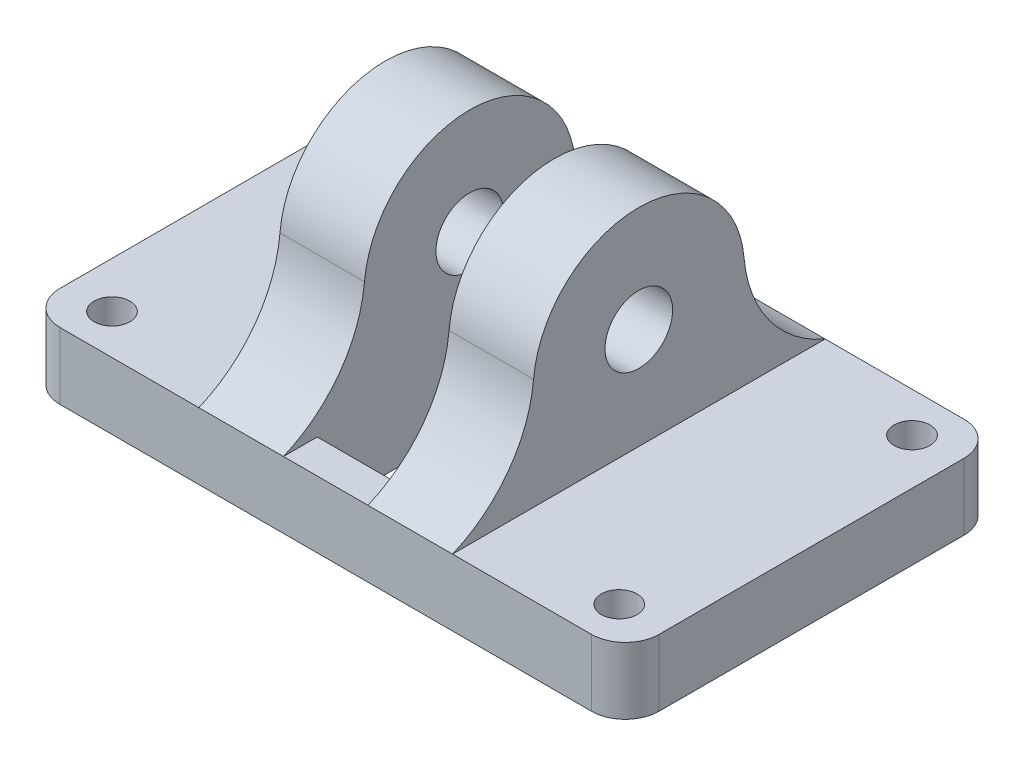
ISO-10303-21;
HEADER;
FILE_DESCRIPTION(('STEP AP214'),'2;1');
FILE_NAME('part.step','',(''),(''),'','','');
FILE_SCHEMA(('AUTOMOTIVE_DESIGN { 1 0 10303 214 1 1 1 1 }'));
ENDSEC;
DATA;
#1=APPLICATION_CONTEXT('core data for automotive mechanical design processes');
#2=APPLICATION_PROTOCOL_DEFINITION('international standard','automotive_design',2000,#1);
#3=PRODUCT_CONTEXT('',#1,'mechanical');
#4=PRODUCT('Part','Part','',(#3));
#5=PRODUCT_RELATED_PRODUCT_CATEGORY('part','',(#4));
#6=PRODUCT_DEFINITION_FORMATION('','',#4);
#7=PRODUCT_DEFINITION_CONTEXT('part definition',#1,'design');
#8=PRODUCT_DEFINITION('design','',#6,#7);
#9=PRODUCT_DEFINITION_SHAPE('','',#8);
#10=(LENGTH_UNIT() NAMED_UNIT(*) SI_UNIT(.MILLI.,.METRE.));
#11=(NAMED_UNIT(*) PLANE_ANGLE_UNIT() SI_UNIT($,.RADIAN.));
#12=(NAMED_UNIT(*) SI_UNIT($,.STERADIAN.) SOLID_ANGLE_UNIT());
#13=UNCERTAINTY_MEASURE_WITH_UNIT(LENGTH_MEASURE(1.E-05),#10,'distance_accuracy_value','');
#14=(GEOMETRIC_REPRESENTATION_CONTEXT(3) GLOBAL_UNCERTAINTY_ASSIGNED_CONTEXT((#13)) GLOBAL_UNIT_ASSIGNED_CONTEXT((#10,
#11,#12)) REPRESENTATION_CONTEXT('',''));
#15=CARTESIAN_POINT('',(0.,0.,0.));
#16=DIRECTION('',(0.,0.,1.));
#17=DIRECTION('',(1.,0.,0.));
#18=AXIS2_PLACEMENT_3D('',#15,#16,#17);
#19=CARTESIAN_POINT('',(0.,5.0038,0.));
#20=DIRECTION('',(0.,-1.,0.));
#21=DIRECTION('',(0.,0.,-1.));
#22=AXIS2_PLACEMENT_3D('',#19,#20,#21);
#23=PLANE('',#22);
#24=DIRECTION('',(0.,0.,1.));
#25=VECTOR('',#24,1.);
#26=CARTESIAN_POINT('',(25.6794,5.0038,0.));
#27=LINE('',#26,#25);
#28=CARTESIAN_POINT('',(25.6794,5.0038,-2.54));
#29=VERTEX_POINT('',#28);
#30=CARTESIAN_POINT('',(25.6794,5.0038,0.));
#31=VERTEX_POINT('',#30);
#32=EDGE_CURVE('E318',#29,#31,#27,.T.);
#33=ORIENTED_EDGE('',*,*,#32,.F.);
#34=DIRECTION('',(1.,0.,0.));
#35=VECTOR('',#34,1.);
#36=CARTESIAN_POINT('',(25.6794,5.0038,-2.54));
#37=LINE('',#36,#35);
#38=CARTESIAN_POINT('',(19.3294,5.0038,-2.54));
#39=VERTEX_POINT('',#38);
#40=EDGE_CURVE('E191',#39,#29,#37,.T.);
#41=ORIENTED_EDGE('',*,*,#40,.F.);
#42=DIRECTION('',(0.,0.,1.));
#43=VECTOR('',#42,1.);
#44=CARTESIAN_POINT('',(19.3294,5.0038,0.));
#45=LINE('',#44,#43);
#46=CARTESIAN_POINT('',(19.3294,5.0038,0.));
#47=VERTEX_POINT('',#46);
#48=EDGE_CURVE('E322',#39,#47,#45,.T.);
#49=ORIENTED_EDGE('',*,*,#48,.T.);
#50=DIRECTION('',(1.,0.,0.));
#51=VECTOR('',#50,1.);
#52=CARTESIAN_POINT('',(0.,5.0038,0.));
#53=LINE('',#52,#51);
#54=EDGE_CURVE('E371',#47,#31,#53,.T.);
#55=ORIENTED_EDGE('',*,*,#54,.T.);
#56=EDGE_LOOP('',(#33,#41,#49,#55));
#57=FACE_BOUND('',#56,.T.);
#58=ADVANCED_FACE('F34',(#57),#23,.F.);
#59=CARTESIAN_POINT('',(41.5544,5.0038,-2.9972));
#60=DIRECTION('',(0.,1.,0.));
#61=DIRECTION('',(0.,0.,-1.));
#62=AXIS2_PLACEMENT_3D('',#59,#60,#61);
#63=CIRCLE('',#62,1.3462);
#64=CARTESIAN_POINT('',(41.5544,5.0038,-4.3434));
#65=VERTEX_POINT('',#64);
#66=EDGE_CURVE('E238',#65,#65,#63,.T.);
#67=ORIENTED_EDGE('',*,*,#66,.F.);
#68=EDGE_LOOP('',(#67));
#69=FACE_BOUND('',#68,.T.);
#70=CARTESIAN_POINT('',(41.5544,5.0038,-24.9936));
#71=DIRECTION('',(0.,1.,0.));
#72=DIRECTION('',(0.,0.,1.));
#73=AXIS2_PLACEMENT_3D('',#70,#71,#72);
#74=CIRCLE('',#73,1.3462);
#75=CARTESIAN_POINT('',(41.5544,5.0038,-23.6474));
#76=VERTEX_POINT('',#75);
#77=EDGE_CURVE('E244',#76,#76,#74,.T.);
#78=ORIENTED_EDGE('',*,*,#77,.F.);
#79=EDGE_LOOP('',(#78));
#80=FACE_BOUND('',#79,.T.);
#81=DIRECTION('',(0.,0.,1.));
#82=VECTOR('',#81,1.);
#83=CARTESIAN_POINT('',(32.0294,5.0038,0.));
#84=LINE('',#83,#82);
#85=CARTESIAN_POINT('',(32.0294,5.0038,-27.9908));
#86=VERTEX_POINT('',#85);
#87=CARTESIAN_POINT('',(32.0294,5.0038,0.));
#88=VERTEX_POINT('',#87);
#89=EDGE_CURVE('E320',#86,#88,#84,.T.);
#90=ORIENTED_EDGE('',*,*,#89,.T.);
#91=CARTESIAN_POINT('',(42.4688,5.0038,0.));
#92=VERTEX_POINT('',#91);
#93=EDGE_CURVE('E256',#88,#92,#53,.T.);
#94=ORIENTED_EDGE('',*,*,#93,.T.);
#95=CARTESIAN_POINT('',(42.4688,5.0038,-2.54));
#96=DIRECTION('',(0.,-1.,0.));
#97=DIRECTION('',(0.,0.,-1.));
#98=AXIS2_PLACEMENT_3D('',#95,#96,#97);
#99=CIRCLE('',#98,2.54);
#100=CARTESIAN_POINT('',(45.0088,5.0038,-2.54));
#101=VERTEX_POINT('',#100);
#102=EDGE_CURVE('E299',#92,#101,#99,.F.);
#103=ORIENTED_EDGE('',*,*,#102,.T.);
#104=DIRECTION('',(0.,0.,-1.));
#105=VECTOR('',#104,1.);
#106=CARTESIAN_POINT('',(45.0088,5.0038,0.));
#107=LINE('',#106,#105);
#108=CARTESIAN_POINT('',(45.0088,5.0038,-25.4508));
#109=VERTEX_POINT('',#108);
#110=EDGE_CURVE('E261',#101,#109,#107,.T.);
#111=ORIENTED_EDGE('',*,*,#110,.T.);
#112=CARTESIAN_POINT('',(42.4688,5.0038,-25.4508));
#113=DIRECTION('',(0.,-1.,0.));
#114=DIRECTION('',(0.,0.,-1.));
#115=AXIS2_PLACEMENT_3D('',#112,#113,#114);
#116=CIRCLE('',#115,2.54);
#117=CARTESIAN_POINT('',(42.4688,5.0038,-27.9908));
#118=VERTEX_POINT('',#117);
#119=EDGE_CURVE('E301',#109,#118,#116,.F.);
#120=ORIENTED_EDGE('',*,*,#119,.T.);
#121=DIRECTION('',(-1.,0.,0.));
#122=VECTOR('',#121,1.);
#123=CARTESIAN_POINT('',(0.,5.0038,-27.9908));
#124=LINE('',#123,#122);
#125=EDGE_CURVE('E266',#118,#86,#124,.T.);
#126=ORIENTED_EDGE('',*,*,#125,.T.);
#127=EDGE_LOOP('',(#90,#94,#103,#111,#120,#126));
#128=FACE_BOUND('',#127,.T.);
#129=ADVANCED_FACE('F382',(#69,#80,#128),#23,.F.);
#130=CARTESIAN_POINT('',(19.3294,5.0038,-27.9908));
#131=VERTEX_POINT('',#130);
#132=CARTESIAN_POINT('',(19.3294,5.0038,-25.4508));
#133=VERTEX_POINT('',#132);
#134=EDGE_CURVE('E323',#131,#133,#45,.T.);
#135=ORIENTED_EDGE('',*,*,#134,.T.);
#136=DIRECTION('',(-1.,0.,0.));
#137=VECTOR('',#136,1.);
#138=CARTESIAN_POINT('',(25.6794,5.0038,-25.4508));
#139=LINE('',#138,#137);
#140=CARTESIAN_POINT('',(25.6794,5.0038,-25.4508));
#141=VERTEX_POINT('',#140);
#142=EDGE_CURVE('E56',#141,#133,#139,.T.);
#143=ORIENTED_EDGE('',*,*,#142,.F.);
#144=CARTESIAN_POINT('',(25.6794,5.0038,-27.9908));
#145=VERTEX_POINT('',#144);
#146=EDGE_CURVE('E179',#145,#141,#27,.T.);
#147=ORIENTED_EDGE('',*,*,#146,.F.);
#148=EDGE_CURVE('E461',#145,#131,#124,.T.);
#149=ORIENTED_EDGE('',*,*,#148,.T.);
#150=EDGE_LOOP('',(#135,#143,#147,#149));
#151=FACE_BOUND('',#150,.T.);
#152=ADVANCED_FACE('F435',(#151),#23,.F.);
#153=CARTESIAN_POINT('',(3.4544,5.0038,-2.9972));
#154=DIRECTION('',(0.,1.,0.));
#155=DIRECTION('',(0.,0.,1.));
#156=AXIS2_PLACEMENT_3D('',#153,#154,#155);
#157=CIRCLE('',#156,1.3462);
#158=CARTESIAN_POINT('',(3.4544,5.0038,-1.651));
#159=VERTEX_POINT('',#158);
#160=EDGE_CURVE('E226',#159,#159,#157,.T.);
#161=ORIENTED_EDGE('',*,*,#160,.F.);
#162=EDGE_LOOP('',(#161));
#163=FACE_BOUND('',#162,.T.);
#164=CARTESIAN_POINT('',(3.4544,5.0038,-24.9936));
#165=DIRECTION('',(0.,1.,0.));
#166=DIRECTION('',(0.,0.,-1.));
#167=AXIS2_PLACEMENT_3D('',#164,#165,#166);
#168=CIRCLE('',#167,1.3462);
#169=CARTESIAN_POINT('',(3.4544,5.0038,-26.3398));
#170=VERTEX_POINT('',#169);
#171=EDGE_CURVE('E232',#170,#170,#168,.T.);
#172=ORIENTED_EDGE('',*,*,#171,.F.);
#173=EDGE_LOOP('',(#172));
#174=FACE_BOUND('',#173,.T.);
#175=DIRECTION('',(0.,0.,1.));
#176=VECTOR('',#175,1.);
#177=CARTESIAN_POINT('',(12.9794,5.0038,0.));
#178=LINE('',#177,#176);
#179=CARTESIAN_POINT('',(12.9794,5.0038,-27.9908));
#180=VERTEX_POINT('',#179);
#181=CARTESIAN_POINT('',(12.9794,5.0038,0.));
#182=VERTEX_POINT('',#181);
#183=EDGE_CURVE('E326',#180,#182,#178,.T.);
#184=ORIENTED_EDGE('',*,*,#183,.F.);
#185=CARTESIAN_POINT('',(2.54,5.0038,-27.9908));
#186=VERTEX_POINT('',#185);
#187=EDGE_CURVE('E265',#180,#186,#124,.T.);
#188=ORIENTED_EDGE('',*,*,#187,.T.);
#189=CARTESIAN_POINT('',(2.54,5.0038,-25.4508));
#190=DIRECTION('',(0.,-1.,0.));
#191=DIRECTION('',(0.,0.,-1.));
#192=AXIS2_PLACEMENT_3D('',#189,#190,#191);
#193=CIRCLE('',#192,2.54);
#194=CARTESIAN_POINT('',(0.,5.0038,-25.4508));
#195=VERTEX_POINT('',#194);
#196=EDGE_CURVE('E303',#186,#195,#193,.F.);
#197=ORIENTED_EDGE('',*,*,#196,.T.);
#198=DIRECTION('',(0.,0.,1.));
#199=VECTOR('',#198,1.);
#200=CARTESIAN_POINT('',(0.,5.0038,0.));
#201=LINE('',#200,#199);
#202=CARTESIAN_POINT('',(0.,5.0038,-2.54));
#203=VERTEX_POINT('',#202);
#204=EDGE_CURVE('E253',#195,#203,#201,.T.);
#205=ORIENTED_EDGE('',*,*,#204,.T.);
#206=CARTESIAN_POINT('',(2.54,5.0038,-2.54));
#207=DIRECTION('',(0.,-1.,0.));
#208=DIRECTION('',(0.,0.,-1.));
#209=AXIS2_PLACEMENT_3D('',#206,#207,#208);
#210=CIRCLE('',#209,2.54);
#211=CARTESIAN_POINT('',(2.54,5.0038,0.));
#212=VERTEX_POINT('',#211);
#213=EDGE_CURVE('E305',#203,#212,#210,.F.);
#214=ORIENTED_EDGE('',*,*,#213,.T.);
#215=EDGE_CURVE('E258',#212,#182,#53,.T.);
#216=ORIENTED_EDGE('',*,*,#215,.T.);
#217=EDGE_LOOP('',(#184,#188,#197,#205,#214,#216));
#218=FACE_BOUND('',#217,.T.);
#219=ADVANCED_FACE('F431',(#163,#174,#218),#23,.F.);
#220=CARTESIAN_POINT('',(0.,5.0038,0.));
#221=DIRECTION('',(1.,0.,0.));
#222=DIRECTION('',(0.,0.,-1.));
#223=AXIS2_PLACEMENT_3D('',#220,#221,#222);
#224=PLANE('',#223);
#225=DIRECTION('',(0.,0.,1.));
#226=VECTOR('',#225,1.);
#227=CARTESIAN_POINT('',(0.,0.,0.));
#228=LINE('',#227,#226);
#229=CARTESIAN_POINT('',(0.,0.,-25.4508));
#230=VERTEX_POINT('',#229);
#231=CARTESIAN_POINT('',(0.,0.,-2.54));
#232=VERTEX_POINT('',#231);
#233=EDGE_CURVE('E250',#230,#232,#228,.T.);
#234=ORIENTED_EDGE('',*,*,#233,.T.);
#235=DIRECTION('',(0.,-1.,0.));
#236=VECTOR('',#235,1.);
#237=CARTESIAN_POINT('',(0.,5.0038,-2.54));
#238=LINE('',#237,#236);
#239=EDGE_CURVE('E297',#232,#203,#238,.F.);
#240=ORIENTED_EDGE('',*,*,#239,.T.);
#241=ORIENTED_EDGE('',*,*,#204,.F.);
#242=DIRECTION('',(0.,-1.,0.));
#243=VECTOR('',#242,1.);
#244=CARTESIAN_POINT('',(0.,5.0038,-25.4508));
#245=LINE('',#244,#243);
#246=EDGE_CURVE('E294',#195,#230,#245,.T.);
#247=ORIENTED_EDGE('',*,*,#246,.T.);
#248=EDGE_LOOP('',(#234,#240,#241,#247));
#249=FACE_BOUND('',#248,.T.);
#250=ADVANCED_FACE('F440',(#249),#224,.F.);
#251=CARTESIAN_POINT('',(0.,5.0038,0.));
#252=DIRECTION('',(0.,0.,-1.));
#253=DIRECTION('',(-1.,0.,0.));
#254=AXIS2_PLACEMENT_3D('',#251,#252,#253);
#255=PLANE('',#254);
#256=ORIENTED_EDGE('',*,*,#215,.F.);
#257=DIRECTION('',(0.,-1.,0.));
#258=VECTOR('',#257,1.);
#259=CARTESIAN_POINT('',(2.54,5.0038,0.));
#260=LINE('',#259,#258);
#261=CARTESIAN_POINT('',(2.54,0.,0.));
#262=VERTEX_POINT('',#261);
#263=EDGE_CURVE('E283',#212,#262,#260,.T.);
#264=ORIENTED_EDGE('',*,*,#263,.T.);
#265=DIRECTION('',(1.,0.,0.));
#266=VECTOR('',#265,1.);
#267=CARTESIAN_POINT('',(0.,0.,0.));
#268=LINE('',#267,#266);
#269=CARTESIAN_POINT('',(42.4688,0.,0.));
#270=VERTEX_POINT('',#269);
#271=EDGE_CURVE('E273',#262,#270,#268,.T.);
#272=ORIENTED_EDGE('',*,*,#271,.T.);
#273=DIRECTION('',(0.,-1.,0.));
#274=VECTOR('',#273,1.);
#275=CARTESIAN_POINT('',(42.4688,5.0038,0.));
#276=LINE('',#275,#274);
#277=EDGE_CURVE('E269',#270,#92,#276,.F.);
#278=ORIENTED_EDGE('',*,*,#277,.T.);
#279=ORIENTED_EDGE('',*,*,#93,.F.);
#280=EDGE_CURVE('E376',#31,#88,#53,.T.);
#281=ORIENTED_EDGE('',*,*,#280,.F.);
#282=ORIENTED_EDGE('',*,*,#54,.F.);
#283=EDGE_CURVE('E262',#182,#47,#53,.T.);
#284=ORIENTED_EDGE('',*,*,#283,.F.);
#285=EDGE_LOOP('',(#256,#264,#272,#278,#279,#281,#282,#284));
#286=FACE_BOUND('',#285,.T.);
#287=ADVANCED_FACE('F373',(#286),#255,.F.);
#288=CARTESIAN_POINT('',(45.0088,5.0038,0.));
#289=DIRECTION('',(-1.,0.,0.));
#290=DIRECTION('',(0.,0.,1.));
#291=AXIS2_PLACEMENT_3D('',#288,#289,#290);
#292=PLANE('',#291);
#293=DIRECTION('',(0.,0.,-1.));
#294=VECTOR('',#293,1.);
#295=CARTESIAN_POINT('',(45.0088,0.,0.));
#296=LINE('',#295,#294);
#297=CARTESIAN_POINT('',(45.0088,0.,-2.54));
#298=VERTEX_POINT('',#297);
#299=CARTESIAN_POINT('',(45.0088,0.,-25.4508));
#300=VERTEX_POINT('',#299);
#301=EDGE_CURVE('E276',#298,#300,#296,.T.);
#302=ORIENTED_EDGE('',*,*,#301,.T.);
#303=DIRECTION('',(0.,-1.,0.));
#304=VECTOR('',#303,1.);
#305=CARTESIAN_POINT('',(45.0088,5.0038,-25.4508));
#306=LINE('',#305,#304);
#307=EDGE_CURVE('E316',#300,#109,#306,.F.);
#308=ORIENTED_EDGE('',*,*,#307,.T.);
#309=ORIENTED_EDGE('',*,*,#110,.F.);
#310=DIRECTION('',(0.,-1.,0.));
#311=VECTOR('',#310,1.);
#312=CARTESIAN_POINT('',(45.0088,5.0038,-2.54));
#313=LINE('',#312,#311);
#314=EDGE_CURVE('E313',#101,#298,#313,.T.);
#315=ORIENTED_EDGE('',*,*,#314,.T.);
#316=EDGE_LOOP('',(#302,#308,#309,#315));
#317=FACE_BOUND('',#316,.T.);
#318=ADVANCED_FACE('F392',(#317),#292,.F.);
#319=CARTESIAN_POINT('',(0.,5.0038,-27.9908));
#320=DIRECTION('',(0.,0.,1.));
#321=DIRECTION('',(1.,0.,0.));
#322=AXIS2_PLACEMENT_3D('',#319,#320,#321);
#323=PLANE('',#322);
#324=DIRECTION('',(-1.,0.,0.));
#325=VECTOR('',#324,1.);
#326=CARTESIAN_POINT('',(0.,0.,-27.9908));
#327=LINE('',#326,#325);
#328=CARTESIAN_POINT('',(42.4688,0.,-27.9908));
#329=VERTEX_POINT('',#328);
#330=CARTESIAN_POINT('',(2.54,0.,-27.9908));
#331=VERTEX_POINT('',#330);
#332=EDGE_CURVE('E257',#329,#331,#327,.T.);
#333=ORIENTED_EDGE('',*,*,#332,.T.);
#334=DIRECTION('',(0.,-1.,0.));
#335=VECTOR('',#334,1.);
#336=CARTESIAN_POINT('',(2.54,5.0038,-27.9908));
#337=LINE('',#336,#335);
#338=EDGE_CURVE('E310',#331,#186,#337,.F.);
#339=ORIENTED_EDGE('',*,*,#338,.T.);
#340=ORIENTED_EDGE('',*,*,#187,.F.);
#341=EDGE_CURVE('E457',#131,#180,#124,.T.);
#342=ORIENTED_EDGE('',*,*,#341,.F.);
#343=ORIENTED_EDGE('',*,*,#148,.F.);
#344=EDGE_CURVE('E270',#86,#145,#124,.T.);
#345=ORIENTED_EDGE('',*,*,#344,.F.);
#346=ORIENTED_EDGE('',*,*,#125,.F.);
#347=DIRECTION('',(0.,-1.,0.));
#348=VECTOR('',#347,1.);
#349=CARTESIAN_POINT('',(42.4688,5.0038,-27.9908));
#350=LINE('',#349,#348);
#351=EDGE_CURVE('E307',#118,#329,#350,.T.);
#352=ORIENTED_EDGE('',*,*,#351,.T.);
#353=EDGE_LOOP('',(#333,#339,#340,#342,#343,#345,#346,#352));
#354=FACE_BOUND('',#353,.T.);
#355=ADVANCED_FACE('F402',(#354),#323,.F.);
#356=CARTESIAN_POINT('',(0.,0.,0.));
#357=DIRECTION('',(0.,-1.,0.));
#358=DIRECTION('',(0.,0.,-1.));
#359=AXIS2_PLACEMENT_3D('',#356,#357,#358);
#360=PLANE('',#359);
#361=DIRECTION('',(0.,0.,-1.));
#362=VECTOR('',#361,1.);
#363=CARTESIAN_POINT('',(25.6794,0.,-2.54));
#364=LINE('',#363,#362);
#365=CARTESIAN_POINT('',(25.6794,0.,-2.54));
#366=VERTEX_POINT('',#365);
#367=CARTESIAN_POINT('',(25.6794,0.,-25.4508));
#368=VERTEX_POINT('',#367);
#369=EDGE_CURVE('E176',#366,#368,#364,.T.);
#370=ORIENTED_EDGE('',*,*,#369,.T.);
#371=DIRECTION('',(-1.,0.,0.));
#372=VECTOR('',#371,1.);
#373=CARTESIAN_POINT('',(25.6794,0.,-25.4508));
#374=LINE('',#373,#372);
#375=CARTESIAN_POINT('',(19.3294,0.,-25.4508));
#376=VERTEX_POINT('',#375);
#377=EDGE_CURVE('E184',#368,#376,#374,.T.);
#378=ORIENTED_EDGE('',*,*,#377,.T.);
#379=DIRECTION('',(0.,0.,1.));
#380=VECTOR('',#379,1.);
#381=CARTESIAN_POINT('',(19.3294,0.,-2.54));
#382=LINE('',#381,#380);
#383=CARTESIAN_POINT('',(19.3294,0.,-2.54));
#384=VERTEX_POINT('',#383);
#385=EDGE_CURVE('E49',#376,#384,#382,.T.);
#386=ORIENTED_EDGE('',*,*,#385,.T.);
#387=DIRECTION('',(1.,0.,0.));
#388=VECTOR('',#387,1.);
#389=CARTESIAN_POINT('',(25.6794,0.,-2.54));
#390=LINE('',#389,#388);
#391=EDGE_CURVE('E181',#384,#366,#390,.T.);
#392=ORIENTED_EDGE('',*,*,#391,.T.);
#393=EDGE_LOOP('',(#370,#378,#386,#392));
#394=FACE_BOUND('',#393,.T.);
#395=CARTESIAN_POINT('',(3.4544,0.,-2.9972));
#396=DIRECTION('',(0.,1.,0.));
#397=DIRECTION('',(0.,0.,1.));
#398=AXIS2_PLACEMENT_3D('',#395,#396,#397);
#399=CIRCLE('',#398,1.3462);
#400=CARTESIAN_POINT('',(3.4544,0.,-1.651));
#401=VERTEX_POINT('',#400);
#402=EDGE_CURVE('E229',#401,#401,#399,.T.);
#403=ORIENTED_EDGE('',*,*,#402,.T.);
#404=EDGE_LOOP('',(#403));
#405=FACE_BOUND('',#404,.T.);
#406=CARTESIAN_POINT('',(3.4544,0.,-24.9936));
#407=DIRECTION('',(0.,1.,0.));
#408=DIRECTION('',(0.,0.,-1.));
#409=AXIS2_PLACEMENT_3D('',#406,#407,#408);
#410=CIRCLE('',#409,1.3462);
#411=CARTESIAN_POINT('',(3.4544,0.,-26.3398));
#412=VERTEX_POINT('',#411);
#413=EDGE_CURVE('E235',#412,#412,#410,.T.);
#414=ORIENTED_EDGE('',*,*,#413,.T.);
#415=EDGE_LOOP('',(#414));
#416=FACE_BOUND('',#415,.T.);
#417=CARTESIAN_POINT('',(41.5544,0.,-2.9972));
#418=DIRECTION('',(0.,1.,0.));
#419=DIRECTION('',(0.,0.,-1.));
#420=AXIS2_PLACEMENT_3D('',#417,#418,#419);
#421=CIRCLE('',#420,1.3462);
#422=CARTESIAN_POINT('',(41.5544,0.,-4.3434));
#423=VERTEX_POINT('',#422);
#424=EDGE_CURVE('E241',#423,#423,#421,.T.);
#425=ORIENTED_EDGE('',*,*,#424,.T.);
#426=EDGE_LOOP('',(#425));
#427=FACE_BOUND('',#426,.T.);
#428=CARTESIAN_POINT('',(41.5544,0.,-24.9936));
#429=DIRECTION('',(0.,1.,0.));
#430=DIRECTION('',(0.,0.,1.));
#431=AXIS2_PLACEMENT_3D('',#428,#429,#430);
#432=CIRCLE('',#431,1.3462);
#433=CARTESIAN_POINT('',(41.5544,0.,-23.6474));
#434=VERTEX_POINT('',#433);
#435=EDGE_CURVE('E247',#434,#434,#432,.T.);
#436=ORIENTED_EDGE('',*,*,#435,.T.);
#437=EDGE_LOOP('',(#436));
#438=FACE_BOUND('',#437,.T.);
#439=ORIENTED_EDGE('',*,*,#271,.F.);
#440=CARTESIAN_POINT('',(2.54,0.,-2.54));
#441=DIRECTION('',(0.,-1.,0.));
#442=DIRECTION('',(0.,0.,-1.));
#443=AXIS2_PLACEMENT_3D('',#440,#441,#442);
#444=CIRCLE('',#443,2.54);
#445=EDGE_CURVE('E292',#262,#232,#444,.T.);
#446=ORIENTED_EDGE('',*,*,#445,.T.);
#447=ORIENTED_EDGE('',*,*,#233,.F.);
#448=CARTESIAN_POINT('',(2.54,0.,-25.4508));
#449=DIRECTION('',(0.,-1.,0.));
#450=DIRECTION('',(0.,0.,-1.));
#451=AXIS2_PLACEMENT_3D('',#448,#449,#450);
#452=CIRCLE('',#451,2.54);
#453=EDGE_CURVE('E290',#230,#331,#452,.T.);
#454=ORIENTED_EDGE('',*,*,#453,.T.);
#455=ORIENTED_EDGE('',*,*,#332,.F.);
#456=CARTESIAN_POINT('',(42.4688,0.,-25.4508));
#457=DIRECTION('',(0.,-1.,0.));
#458=DIRECTION('',(0.,0.,-1.));
#459=AXIS2_PLACEMENT_3D('',#456,#457,#458);
#460=CIRCLE('',#459,2.54);
#461=EDGE_CURVE('E288',#329,#300,#460,.T.);
#462=ORIENTED_EDGE('',*,*,#461,.T.);
#463=ORIENTED_EDGE('',*,*,#301,.F.);
#464=CARTESIAN_POINT('',(42.4688,0.,-2.54));
#465=DIRECTION('',(0.,-1.,0.));
#466=DIRECTION('',(0.,0.,-1.));
#467=AXIS2_PLACEMENT_3D('',#464,#465,#466);
#468=CIRCLE('',#467,2.54);
#469=EDGE_CURVE('E286',#298,#270,#468,.T.);
#470=ORIENTED_EDGE('',*,*,#469,.T.);
#471=EDGE_LOOP('',(#439,#446,#447,#454,#455,#462,#463,#470));
#472=FACE_BOUND('',#471,.T.);
#473=ADVANCED_FACE('F188',(#394,#405,#416,#427,#438,#472),#360,.T.);
#474=CARTESIAN_POINT('',(41.5544,0.,-24.9936));
#475=DIRECTION('',(0.,1.,0.));
#476=DIRECTION('',(0.,0.,1.));
#477=AXIS2_PLACEMENT_3D('',#474,#475,#476);
#478=CYLINDRICAL_SURFACE('',#477,1.3462);
#479=ORIENTED_EDGE('',*,*,#435,.F.);
#480=EDGE_LOOP('',(#479));
#481=FACE_BOUND('',#480,.T.);
#482=ORIENTED_EDGE('',*,*,#77,.T.);
#483=EDGE_LOOP('',(#482));
#484=FACE_BOUND('',#483,.T.);
#485=ADVANCED_FACE('F490',(#481,#484),#478,.F.);
#486=CARTESIAN_POINT('',(41.5544,0.,-2.9972));
#487=DIRECTION('',(0.,1.,0.));
#488=DIRECTION('',(0.,0.,1.));
#489=AXIS2_PLACEMENT_3D('',#486,#487,#488);
#490=CYLINDRICAL_SURFACE('',#489,1.3462);
#491=ORIENTED_EDGE('',*,*,#424,.F.);
#492=EDGE_LOOP('',(#491));
#493=FACE_BOUND('',#492,.T.);
#494=ORIENTED_EDGE('',*,*,#66,.T.);
#495=EDGE_LOOP('',(#494));
#496=FACE_BOUND('',#495,.T.);
#497=ADVANCED_FACE('F494',(#493,#496),#490,.F.);
#498=CARTESIAN_POINT('',(3.4544,0.,-24.9936));
#499=DIRECTION('',(0.,1.,0.));
#500=DIRECTION('',(0.,0.,1.));
#501=AXIS2_PLACEMENT_3D('',#498,#499,#500);
#502=CYLINDRICAL_SURFACE('',#501,1.3462);
#503=ORIENTED_EDGE('',*,*,#413,.F.);
#504=EDGE_LOOP('',(#503));
#505=FACE_BOUND('',#504,.T.);
#506=ORIENTED_EDGE('',*,*,#171,.T.);
#507=EDGE_LOOP('',(#506));
#508=FACE_BOUND('',#507,.T.);
#509=ADVANCED_FACE('F499',(#505,#508),#502,.F.);
#510=CARTESIAN_POINT('',(3.4544,0.,-2.9972));
#511=DIRECTION('',(0.,1.,0.));
#512=DIRECTION('',(0.,0.,1.));
#513=AXIS2_PLACEMENT_3D('',#510,#511,#512);
#514=CYLINDRICAL_SURFACE('',#513,1.3462);
#515=ORIENTED_EDGE('',*,*,#402,.F.);
#516=EDGE_LOOP('',(#515));
#517=FACE_BOUND('',#516,.T.);
#518=ORIENTED_EDGE('',*,*,#160,.T.);
#519=EDGE_LOOP('',(#518));
#520=FACE_BOUND('',#519,.T.);
#521=ADVANCED_FACE('F481',(#517,#520),#514,.F.);
#522=CARTESIAN_POINT('',(2.54,5.0038,-2.54));
#523=DIRECTION('',(0.,-1.,0.));
#524=DIRECTION('',(0.,0.,-1.));
#525=AXIS2_PLACEMENT_3D('',#522,#523,#524);
#526=CYLINDRICAL_SURFACE('',#525,2.54);
#527=ORIENTED_EDGE('',*,*,#213,.F.);
#528=ORIENTED_EDGE('',*,*,#239,.F.);
#529=ORIENTED_EDGE('',*,*,#445,.F.);
#530=ORIENTED_EDGE('',*,*,#263,.F.);
#531=EDGE_LOOP('',(#527,#528,#529,#530));
#532=FACE_BOUND('',#531,.T.);
#533=ADVANCED_FACE('F478',(#532),#526,.T.);
#534=CARTESIAN_POINT('',(2.54,5.0038,-25.4508));
#535=DIRECTION('',(0.,-1.,0.));
#536=DIRECTION('',(0.,0.,-1.));
#537=AXIS2_PLACEMENT_3D('',#534,#535,#536);
#538=CYLINDRICAL_SURFACE('',#537,2.54);
#539=ORIENTED_EDGE('',*,*,#196,.F.);
#540=ORIENTED_EDGE('',*,*,#338,.F.);
#541=ORIENTED_EDGE('',*,*,#453,.F.);
#542=ORIENTED_EDGE('',*,*,#246,.F.);
#543=EDGE_LOOP('',(#539,#540,#541,#542));
#544=FACE_BOUND('',#543,.T.);
#545=ADVANCED_FACE('F475',(#544),#538,.T.);
#546=CARTESIAN_POINT('',(42.4688,5.0038,-25.4508));
#547=DIRECTION('',(0.,-1.,0.));
#548=DIRECTION('',(0.,0.,-1.));
#549=AXIS2_PLACEMENT_3D('',#546,#547,#548);
#550=CYLINDRICAL_SURFACE('',#549,2.54);
#551=ORIENTED_EDGE('',*,*,#119,.F.);
#552=ORIENTED_EDGE('',*,*,#307,.F.);
#553=ORIENTED_EDGE('',*,*,#461,.F.);
#554=ORIENTED_EDGE('',*,*,#351,.F.);
#555=EDGE_LOOP('',(#551,#552,#553,#554));
#556=FACE_BOUND('',#555,.T.);
#557=ADVANCED_FACE('F399',(#556),#550,.T.);
#558=CARTESIAN_POINT('',(42.4688,5.0038,-2.54));
#559=DIRECTION('',(0.,-1.,0.));
#560=DIRECTION('',(0.,0.,-1.));
#561=AXIS2_PLACEMENT_3D('',#558,#559,#560);
#562=CYLINDRICAL_SURFACE('',#561,2.54);
#563=ORIENTED_EDGE('',*,*,#102,.F.);
#564=ORIENTED_EDGE('',*,*,#277,.F.);
#565=ORIENTED_EDGE('',*,*,#469,.F.);
#566=ORIENTED_EDGE('',*,*,#314,.F.);
#567=EDGE_LOOP('',(#563,#564,#565,#566));
#568=FACE_BOUND('',#567,.T.);
#569=ADVANCED_FACE('F389',(#568),#562,.T.);
#570=CARTESIAN_POINT('',(32.0294,12.6238,-13.9954));
#571=DIRECTION('',(1.,0.,0.));
#572=DIRECTION('',(0.,0.,-1.));
#573=AXIS2_PLACEMENT_3D('',#570,#571,#572);
#574=PLANE('',#573);
#575=CARTESIAN_POINT('',(32.0294,12.6238,-13.9954));
#576=DIRECTION('',(1.,0.,0.));
#577=DIRECTION('',(0.,0.,-1.));
#578=AXIS2_PLACEMENT_3D('',#575,#576,#577);
#579=CIRCLE('',#578,2.54);
#580=CARTESIAN_POINT('',(32.0294,12.6238,-16.5354));
#581=VERTEX_POINT('',#580);
#582=EDGE_CURVE('E217',#581,#581,#579,.T.);
#583=ORIENTED_EDGE('',*,*,#582,.F.);
#584=EDGE_LOOP('',(#583));
#585=FACE_BOUND('',#584,.T.);
#586=ORIENTED_EDGE('',*,*,#89,.F.);
#587=CARTESIAN_POINT('',(32.0294,14.2243672577233,-31.8613478637786));
#588=DIRECTION('',(1.,0.,0.));
#589=DIRECTION('',(0.,0.,-1.));
#590=AXIS2_PLACEMENT_3D('',#587,#588,#589);
#591=CIRCLE('',#590,10.000000066);
#592=CARTESIAN_POINT('',(32.0294,13.33206495116,-21.9012375273565));
#593=VERTEX_POINT('',#592);
#594=EDGE_CURVE('E345',#86,#593,#591,.F.);
#595=ORIENTED_EDGE('',*,*,#594,.T.);
#596=CARTESIAN_POINT('',(32.0294,12.6238,-13.9954));
#597=DIRECTION('',(1.,0.,0.));
#598=DIRECTION('',(0.,0.,-1.));
#599=AXIS2_PLACEMENT_3D('',#596,#597,#598);
#600=CIRCLE('',#599,7.9375);
#601=CARTESIAN_POINT('',(32.0294,13.33206495116,-6.08956247264351));
#602=VERTEX_POINT('',#601);
#603=EDGE_CURVE('E223',#593,#602,#600,.T.);
#604=ORIENTED_EDGE('',*,*,#603,.T.);
#605=CARTESIAN_POINT('',(32.0294,14.2243672577233,3.87054786377857));
#606=DIRECTION('',(1.,0.,0.));
#607=DIRECTION('',(0.,0.,-1.));
#608=AXIS2_PLACEMENT_3D('',#605,#606,#607);
#609=CIRCLE('',#608,10.000000066);
#610=EDGE_CURVE('E338',#602,#88,#609,.F.);
#611=ORIENTED_EDGE('',*,*,#610,.T.);
#612=EDGE_LOOP('',(#586,#595,#604,#611));
#613=FACE_BOUND('',#612,.T.);
#614=ADVANCED_FACE('F413',(#585,#613),#574,.T.);
#615=CARTESIAN_POINT('',(25.6794,12.6238,-13.9954));
#616=DIRECTION('',(1.,0.,0.));
#617=DIRECTION('',(0.,0.,-1.));
#618=AXIS2_PLACEMENT_3D('',#615,#616,#617);
#619=PLANE('',#618);
#620=CARTESIAN_POINT('',(25.6794,12.6238,-13.9954));
#621=DIRECTION('',(1.,0.,0.));
#622=DIRECTION('',(0.,0.,-1.));
#623=AXIS2_PLACEMENT_3D('',#620,#621,#622);
#624=CIRCLE('',#623,2.54);
#625=CARTESIAN_POINT('',(25.6794,12.6238,-16.5354));
#626=VERTEX_POINT('',#625);
#627=EDGE_CURVE('E214',#626,#626,#624,.T.);
#628=ORIENTED_EDGE('',*,*,#627,.T.);
#629=EDGE_LOOP('',(#628));
#630=FACE_BOUND('',#629,.T.);
#631=CARTESIAN_POINT('',(25.6794,12.6238,-13.9954));
#632=DIRECTION('',(1.,0.,0.));
#633=DIRECTION('',(0.,0.,-1.));
#634=AXIS2_PLACEMENT_3D('',#631,#632,#633);
#635=CIRCLE('',#634,7.9375);
#636=CARTESIAN_POINT('',(25.6794,13.33206495116,-21.9012375273565));
#637=VERTEX_POINT('',#636);
#638=CARTESIAN_POINT('',(25.6794,13.33206495116,-6.08956247264351));
#639=VERTEX_POINT('',#638);
#640=EDGE_CURVE('E220',#637,#639,#635,.T.);
#641=ORIENTED_EDGE('',*,*,#640,.F.);
#642=CARTESIAN_POINT('',(25.6794,14.2243672577233,-31.8613478637786));
#643=DIRECTION('',(1.,0.,0.));
#644=DIRECTION('',(0.,0.,-1.));
#645=AXIS2_PLACEMENT_3D('',#642,#643,#644);
#646=CIRCLE('',#645,10.000000066);
#647=EDGE_CURVE('E343',#637,#145,#646,.T.);
#648=ORIENTED_EDGE('',*,*,#647,.T.);
#649=ORIENTED_EDGE('',*,*,#146,.T.);
#650=DIRECTION('',(0.,1.,0.));
#651=VECTOR('',#650,1.);
#652=CARTESIAN_POINT('',(25.6794,0.,-25.4508));
#653=LINE('',#652,#651);
#654=EDGE_CURVE('E171',#368,#141,#653,.T.);
#655=ORIENTED_EDGE('',*,*,#654,.F.);
#656=ORIENTED_EDGE('',*,*,#369,.F.);
#657=DIRECTION('',(0.,1.,0.));
#658=VECTOR('',#657,1.);
#659=CARTESIAN_POINT('',(25.6794,0.,-2.54));
#660=LINE('',#659,#658);
#661=EDGE_CURVE('E199',#366,#29,#660,.T.);
#662=ORIENTED_EDGE('',*,*,#661,.T.);
#663=ORIENTED_EDGE('',*,*,#32,.T.);
#664=CARTESIAN_POINT('',(25.6794,14.2243672577233,3.87054786377857));
#665=DIRECTION('',(1.,0.,0.));
#666=DIRECTION('',(0.,0.,-1.));
#667=AXIS2_PLACEMENT_3D('',#664,#665,#666);
#668=CIRCLE('',#667,10.000000066);
#669=EDGE_CURVE('E341',#31,#639,#668,.T.);
#670=ORIENTED_EDGE('',*,*,#669,.T.);
#671=EDGE_LOOP('',(#641,#648,#649,#655,#656,#662,#663,#670));
#672=FACE_BOUND('',#671,.T.);
#673=ADVANCED_FACE('F174',(#630,#672),#619,.F.);
#674=CARTESIAN_POINT('',(32.0294,12.6238,-13.9954));
#675=DIRECTION('',(-1.,0.,0.));
#676=DIRECTION('',(0.,0.,1.));
#677=AXIS2_PLACEMENT_3D('',#674,#675,#676);
#678=CYLINDRICAL_SURFACE('',#677,7.9375);
#679=ORIENTED_EDGE('',*,*,#640,.T.);
#680=DIRECTION('',(-1.,0.,0.));
#681=VECTOR('',#680,1.);
#682=CARTESIAN_POINT('',(32.0294,13.33206495116,-6.08956247264351));
#683=LINE('',#682,#681);
#684=EDGE_CURVE('E331',#639,#602,#683,.F.);
#685=ORIENTED_EDGE('',*,*,#684,.T.);
#686=ORIENTED_EDGE('',*,*,#603,.F.);
#687=DIRECTION('',(-1.,0.,0.));
#688=VECTOR('',#687,1.);
#689=CARTESIAN_POINT('',(32.0294,13.33206495116,-21.9012375273565));
#690=LINE('',#689,#688);
#691=EDGE_CURVE('E328',#593,#637,#690,.T.);
#692=ORIENTED_EDGE('',*,*,#691,.T.);
#693=EDGE_LOOP('',(#679,#685,#686,#692));
#694=FACE_BOUND('',#693,.T.);
#695=ADVANCED_FACE('F415',(#694),#678,.T.);
#696=CARTESIAN_POINT('',(32.0294,12.6238,-13.9954));
#697=DIRECTION('',(-1.,0.,0.));
#698=DIRECTION('',(0.,0.,1.));
#699=AXIS2_PLACEMENT_3D('',#696,#697,#698);
#700=CYLINDRICAL_SURFACE('',#699,2.54);
#701=ORIENTED_EDGE('',*,*,#582,.T.);
#702=EDGE_LOOP('',(#701));
#703=FACE_BOUND('',#702,.T.);
#704=ORIENTED_EDGE('',*,*,#627,.F.);
#705=EDGE_LOOP('',(#704));
#706=FACE_BOUND('',#705,.T.);
#707=ADVANCED_FACE('F513',(#703,#706),#700,.F.);
#708=CARTESIAN_POINT('',(12.9794,12.6238,-13.9954));
#709=DIRECTION('',(1.,0.,0.));
#710=DIRECTION('',(0.,0.,-1.));
#711=AXIS2_PLACEMENT_3D('',#708,#709,#710);
#712=CYLINDRICAL_SURFACE('',#711,7.9375);
#713=CARTESIAN_POINT('',(19.3294,12.6238,-13.9954));
#714=DIRECTION('',(1.,0.,0.));
#715=DIRECTION('',(0.,0.,-1.));
#716=AXIS2_PLACEMENT_3D('',#713,#714,#715);
#717=CIRCLE('',#716,7.9375);
#718=CARTESIAN_POINT('',(19.3294,13.33206495116,-21.9012375273565));
#719=VERTEX_POINT('',#718);
#720=CARTESIAN_POINT('',(19.3294,13.33206495116,-6.08956247264351));
#721=VERTEX_POINT('',#720);
#722=EDGE_CURVE('E208',#719,#721,#717,.T.);
#723=ORIENTED_EDGE('',*,*,#722,.F.);
#724=DIRECTION('',(1.,0.,0.));
#725=VECTOR('',#724,1.);
#726=CARTESIAN_POINT('',(12.9794,13.33206495116,-21.9012375273565));
#727=LINE('',#726,#725);
#728=CARTESIAN_POINT('',(12.9794,13.33206495116,-21.9012375273565));
#729=VERTEX_POINT('',#728);
#730=EDGE_CURVE('E336',#719,#729,#727,.F.);
#731=ORIENTED_EDGE('',*,*,#730,.T.);
#732=CARTESIAN_POINT('',(12.9794,12.6238,-13.9954));
#733=DIRECTION('',(1.,0.,0.));
#734=DIRECTION('',(0.,0.,-1.));
#735=AXIS2_PLACEMENT_3D('',#732,#733,#734);
#736=CIRCLE('',#735,7.9375);
#737=CARTESIAN_POINT('',(12.9794,13.33206495116,-6.08956247264351));
#738=VERTEX_POINT('',#737);
#739=EDGE_CURVE('E211',#729,#738,#736,.T.);
#740=ORIENTED_EDGE('',*,*,#739,.T.);
#741=DIRECTION('',(1.,0.,0.));
#742=VECTOR('',#741,1.);
#743=CARTESIAN_POINT('',(12.9794,13.33206495116,-6.08956247264351));
#744=LINE('',#743,#742);
#745=EDGE_CURVE('E334',#738,#721,#744,.T.);
#746=ORIENTED_EDGE('',*,*,#745,.T.);
#747=EDGE_LOOP('',(#723,#731,#740,#746));
#748=FACE_BOUND('',#747,.T.);
#749=ADVANCED_FACE('F362',(#748),#712,.T.);
#750=CARTESIAN_POINT('',(12.9794,12.6238,-13.9954));
#751=DIRECTION('',(1.,0.,0.));
#752=DIRECTION('',(0.,0.,-1.));
#753=AXIS2_PLACEMENT_3D('',#750,#751,#752);
#754=PLANE('',#753);
#755=CARTESIAN_POINT('',(12.9794,12.6238,-13.9954));
#756=DIRECTION('',(1.,0.,0.));
#757=DIRECTION('',(0.,0.,-1.));
#758=AXIS2_PLACEMENT_3D('',#755,#756,#757);
#759=CIRCLE('',#758,2.54);
#760=CARTESIAN_POINT('',(12.9794,12.6238,-16.5354));
#761=VERTEX_POINT('',#760);
#762=EDGE_CURVE('E205',#761,#761,#759,.T.);
#763=ORIENTED_EDGE('',*,*,#762,.T.);
#764=EDGE_LOOP('',(#763));
#765=FACE_BOUND('',#764,.T.);
#766=ORIENTED_EDGE('',*,*,#739,.F.);
#767=CARTESIAN_POINT('',(12.9794,14.2243672577233,-31.8613478637786));
#768=DIRECTION('',(1.,0.,0.));
#769=DIRECTION('',(0.,0.,-1.));
#770=AXIS2_PLACEMENT_3D('',#767,#768,#769);
#771=CIRCLE('',#770,10.000000066);
#772=EDGE_CURVE('E349',#729,#180,#771,.T.);
#773=ORIENTED_EDGE('',*,*,#772,.T.);
#774=ORIENTED_EDGE('',*,*,#183,.T.);
#775=CARTESIAN_POINT('',(12.9794,14.2243672577233,3.87054786377857));
#776=DIRECTION('',(1.,0.,0.));
#777=DIRECTION('',(0.,0.,-1.));
#778=AXIS2_PLACEMENT_3D('',#775,#776,#777);
#779=CIRCLE('',#778,10.000000066);
#780=EDGE_CURVE('E42',#182,#738,#779,.T.);
#781=ORIENTED_EDGE('',*,*,#780,.T.);
#782=EDGE_LOOP('',(#766,#773,#774,#781));
#783=FACE_BOUND('',#782,.T.);
#784=ADVANCED_FACE('F354',(#765,#783),#754,.F.);
#785=CARTESIAN_POINT('',(19.3294,12.6238,-13.9954));
#786=DIRECTION('',(1.,0.,0.));
#787=DIRECTION('',(0.,0.,-1.));
#788=AXIS2_PLACEMENT_3D('',#785,#786,#787);
#789=PLANE('',#788);
#790=CARTESIAN_POINT('',(19.3294,12.6238,-13.9954));
#791=DIRECTION('',(1.,0.,0.));
#792=DIRECTION('',(0.,0.,-1.));
#793=AXIS2_PLACEMENT_3D('',#790,#791,#792);
#794=CIRCLE('',#793,2.54);
#795=CARTESIAN_POINT('',(19.3294,12.6238,-16.5354));
#796=VERTEX_POINT('',#795);
#797=EDGE_CURVE('E201',#796,#796,#794,.T.);
#798=ORIENTED_EDGE('',*,*,#797,.F.);
#799=EDGE_LOOP('',(#798));
#800=FACE_BOUND('',#799,.T.);
#801=ORIENTED_EDGE('',*,*,#134,.F.);
#802=CARTESIAN_POINT('',(19.3294,14.2243672577233,-31.8613478637786));
#803=DIRECTION('',(1.,0.,0.));
#804=DIRECTION('',(0.,0.,-1.));
#805=AXIS2_PLACEMENT_3D('',#802,#803,#804);
#806=CIRCLE('',#805,10.000000066);
#807=EDGE_CURVE('E347',#131,#719,#806,.F.);
#808=ORIENTED_EDGE('',*,*,#807,.T.);
#809=ORIENTED_EDGE('',*,*,#722,.T.);
#810=CARTESIAN_POINT('',(19.3294,14.2243672577233,3.87054786377857));
#811=DIRECTION('',(1.,0.,0.));
#812=DIRECTION('',(0.,0.,-1.));
#813=AXIS2_PLACEMENT_3D('',#810,#811,#812);
#814=CIRCLE('',#813,10.000000066);
#815=EDGE_CURVE('E11',#721,#47,#814,.F.);
#816=ORIENTED_EDGE('',*,*,#815,.T.);
#817=ORIENTED_EDGE('',*,*,#48,.F.);
#818=DIRECTION('',(0.,1.,0.));
#819=VECTOR('',#818,1.);
#820=CARTESIAN_POINT('',(19.3294,0.,-2.54));
#821=LINE('',#820,#819);
#822=EDGE_CURVE('E202',#384,#39,#821,.T.);
#823=ORIENTED_EDGE('',*,*,#822,.F.);
#824=ORIENTED_EDGE('',*,*,#385,.F.);
#825=DIRECTION('',(0.,1.,0.));
#826=VECTOR('',#825,1.);
#827=CARTESIAN_POINT('',(19.3294,0.,-25.4508));
#828=LINE('',#827,#826);
#829=EDGE_CURVE('E180',#376,#133,#828,.T.);
#830=ORIENTED_EDGE('',*,*,#829,.T.);
#831=EDGE_LOOP('',(#801,#808,#809,#816,#817,#823,#824,#830));
#832=FACE_BOUND('',#831,.T.);
#833=ADVANCED_FACE('F367',(#800,#832),#789,.T.);
#834=CARTESIAN_POINT('',(12.9794,12.6238,-13.9954));
#835=DIRECTION('',(1.,0.,0.));
#836=DIRECTION('',(0.,0.,-1.));
#837=AXIS2_PLACEMENT_3D('',#834,#835,#836);
#838=CYLINDRICAL_SURFACE('',#837,2.54);
#839=ORIENTED_EDGE('',*,*,#762,.F.);
#840=EDGE_LOOP('',(#839));
#841=FACE_BOUND('',#840,.T.);
#842=ORIENTED_EDGE('',*,*,#797,.T.);
#843=EDGE_LOOP('',(#842));
#844=FACE_BOUND('',#843,.T.);
#845=ADVANCED_FACE('F470',(#841,#844),#838,.F.);
#846=CARTESIAN_POINT('',(0.,14.2243672577233,3.87054786377857));
#847=DIRECTION('',(-1.,0.,0.));
#848=DIRECTION('',(0.,0.,1.));
#849=AXIS2_PLACEMENT_3D('',#846,#847,#848);
#850=CYLINDRICAL_SURFACE('',#849,10.000000066);
#851=ORIENTED_EDGE('',*,*,#669,.F.);
#852=ORIENTED_EDGE('',*,*,#280,.T.);
#853=ORIENTED_EDGE('',*,*,#610,.F.);
#854=ORIENTED_EDGE('',*,*,#684,.F.);
#855=EDGE_LOOP('',(#851,#852,#853,#854));
#856=FACE_BOUND('',#855,.T.);
#857=ADVANCED_FACE('F417',(#856),#850,.F.);
#858=CARTESIAN_POINT('',(0.,14.2243672577233,-31.8613478637786));
#859=DIRECTION('',(1.,0.,0.));
#860=DIRECTION('',(0.,0.,-1.));
#861=AXIS2_PLACEMENT_3D('',#858,#859,#860);
#862=CYLINDRICAL_SURFACE('',#861,10.000000066);
#863=ORIENTED_EDGE('',*,*,#594,.F.);
#864=ORIENTED_EDGE('',*,*,#344,.T.);
#865=ORIENTED_EDGE('',*,*,#647,.F.);
#866=ORIENTED_EDGE('',*,*,#691,.F.);
#867=EDGE_LOOP('',(#863,#864,#865,#866));
#868=FACE_BOUND('',#867,.T.);
#869=ADVANCED_FACE('F410',(#868),#862,.F.);
#870=CARTESIAN_POINT('',(12.9794,14.2243672577233,-31.8613478637786));
#871=DIRECTION('',(-1.,0.,0.));
#872=DIRECTION('',(0.,0.,1.));
#873=AXIS2_PLACEMENT_3D('',#870,#871,#872);
#874=CYLINDRICAL_SURFACE('',#873,10.000000066);
#875=ORIENTED_EDGE('',*,*,#772,.F.);
#876=ORIENTED_EDGE('',*,*,#730,.F.);
#877=ORIENTED_EDGE('',*,*,#807,.F.);
#878=ORIENTED_EDGE('',*,*,#341,.T.);
#879=EDGE_LOOP('',(#875,#876,#877,#878));
#880=FACE_BOUND('',#879,.T.);
#881=ADVANCED_FACE('F428',(#880),#874,.F.);
#882=CARTESIAN_POINT('',(12.9794,14.2243672577233,3.87054786377857));
#883=DIRECTION('',(1.,0.,0.));
#884=DIRECTION('',(0.,0.,-1.));
#885=AXIS2_PLACEMENT_3D('',#882,#883,#884);
#886=CYLINDRICAL_SURFACE('',#885,10.000000066);
#887=ORIENTED_EDGE('',*,*,#815,.F.);
#888=ORIENTED_EDGE('',*,*,#745,.F.);
#889=ORIENTED_EDGE('',*,*,#780,.F.);
#890=ORIENTED_EDGE('',*,*,#283,.T.);
#891=EDGE_LOOP('',(#887,#888,#889,#890));
#892=FACE_BOUND('',#891,.T.);
#893=ADVANCED_FACE('F36',(#892),#886,.F.);
#894=CARTESIAN_POINT('',(25.6794,0.,-2.54));
#895=DIRECTION('',(0.,0.,1.));
#896=DIRECTION('',(1.,0.,0.));
#897=AXIS2_PLACEMENT_3D('',#894,#895,#896);
#898=PLANE('',#897);
#899=ORIENTED_EDGE('',*,*,#40,.T.);
#900=ORIENTED_EDGE('',*,*,#661,.F.);
#901=ORIENTED_EDGE('',*,*,#391,.F.);
#902=ORIENTED_EDGE('',*,*,#822,.T.);
#903=EDGE_LOOP('',(#899,#900,#901,#902));
#904=FACE_BOUND('',#903,.T.);
#905=ADVANCED_FACE('F420',(#904),#898,.F.);
#906=CARTESIAN_POINT('',(25.6794,0.,-25.4508));
#907=DIRECTION('',(0.,0.,-1.));
#908=DIRECTION('',(-1.,0.,0.));
#909=AXIS2_PLACEMENT_3D('',#906,#907,#908);
#910=PLANE('',#909);
#911=ORIENTED_EDGE('',*,*,#142,.T.);
#912=ORIENTED_EDGE('',*,*,#829,.F.);
#913=ORIENTED_EDGE('',*,*,#377,.F.);
#914=ORIENTED_EDGE('',*,*,#654,.T.);
#915=EDGE_LOOP('',(#911,#912,#913,#914));
#916=FACE_BOUND('',#915,.T.);
#917=ADVANCED_FACE('F185',(#916),#910,.F.);
#918=CLOSED_SHELL('',(#58,#129,#152,#219,#250,#287,#318,#355,#473,#485,#497,#509,#521,#533,#545,
#557,#569,#614,#673,#695,#707,#749,#784,#833,#845,#857,#869,#881,#893,#905,#917));
#919=MANIFOLD_SOLID_BREP('B2',#918);
#920=ADVANCED_BREP_SHAPE_REPRESENTATION('',(#18,#919),#14);
#921=SHAPE_DEFINITION_REPRESENTATION(#9,#920);
ENDSEC;
END-ISO-10303-21;
